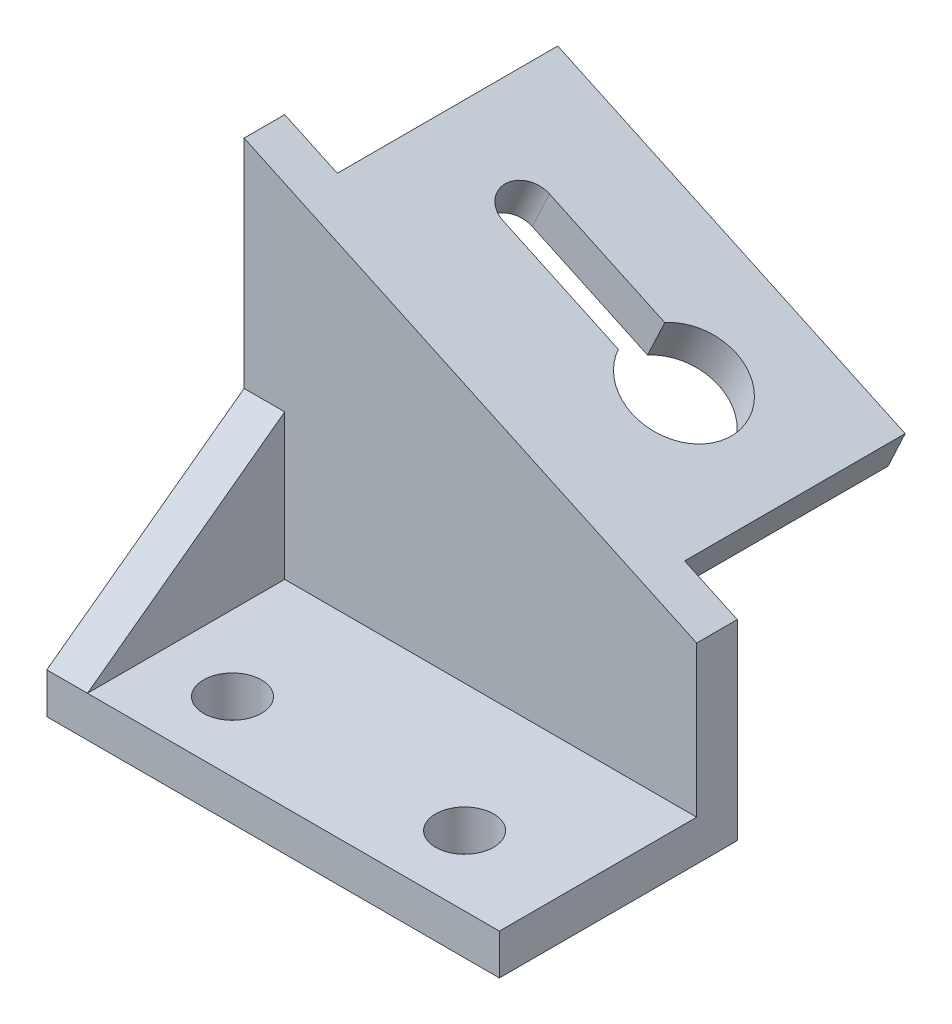
ISO-10303-21;
HEADER;
FILE_DESCRIPTION(('STEP AP214'),'2;1');
FILE_NAME('part.step','',(''),(''),'','','');
FILE_SCHEMA(('AUTOMOTIVE_DESIGN { 1 0 10303 214 1 1 1 1 }'));
ENDSEC;
DATA;
#1=APPLICATION_CONTEXT('core data for automotive mechanical design processes');
#2=APPLICATION_PROTOCOL_DEFINITION('international standard','automotive_design',2000,#1);
#3=PRODUCT_CONTEXT('',#1,'mechanical');
#4=PRODUCT('Part','Part','',(#3));
#5=PRODUCT_RELATED_PRODUCT_CATEGORY('part','',(#4));
#6=PRODUCT_DEFINITION_FORMATION('','',#4);
#7=PRODUCT_DEFINITION_CONTEXT('part definition',#1,'design');
#8=PRODUCT_DEFINITION('design','',#6,#7);
#9=PRODUCT_DEFINITION_SHAPE('','',#8);
#10=(LENGTH_UNIT() NAMED_UNIT(*) SI_UNIT(.MILLI.,.METRE.));
#11=(NAMED_UNIT(*) PLANE_ANGLE_UNIT() SI_UNIT($,.RADIAN.));
#12=(NAMED_UNIT(*) SI_UNIT($,.STERADIAN.) SOLID_ANGLE_UNIT());
#13=UNCERTAINTY_MEASURE_WITH_UNIT(LENGTH_MEASURE(1.E-05),#10,'distance_accuracy_value','');
#14=(GEOMETRIC_REPRESENTATION_CONTEXT(3) GLOBAL_UNCERTAINTY_ASSIGNED_CONTEXT((#13)) GLOBAL_UNIT_ASSIGNED_CONTEXT((#10,
#11,#12)) REPRESENTATION_CONTEXT('',''));
#15=CARTESIAN_POINT('',(0.,0.,0.));
#16=DIRECTION('',(0.,0.,1.));
#17=DIRECTION('',(1.,0.,0.));
#18=AXIS2_PLACEMENT_3D('',#15,#16,#17);
#19=CARTESIAN_POINT('',(0.,7.,0.));
#20=DIRECTION('',(0.,1.,0.));
#21=DIRECTION('',(0.,0.,1.));
#22=AXIS2_PLACEMENT_3D('',#19,#20,#21);
#23=PLANE('',#22);
#24=CARTESIAN_POINT('',(20.,7.,-12.));
#25=DIRECTION('',(0.,1.,0.));
#26=DIRECTION('',(0.,0.,1.));
#27=AXIS2_PLACEMENT_3D('',#24,#25,#26);
#28=CIRCLE('',#27,5.);
#29=CARTESIAN_POINT('',(20.,7.,-7.));
#30=VERTEX_POINT('',#29);
#31=EDGE_CURVE('E236',#30,#30,#28,.T.);
#32=ORIENTED_EDGE('',*,*,#31,.F.);
#33=EDGE_LOOP('',(#32));
#34=FACE_BOUND('',#33,.T.);
#35=CARTESIAN_POINT('',(60.,7.,-12.));
#36=DIRECTION('',(0.,1.,0.));
#37=DIRECTION('',(0.,0.,1.));
#38=AXIS2_PLACEMENT_3D('',#35,#36,#37);
#39=CIRCLE('',#38,5.);
#40=CARTESIAN_POINT('',(60.,7.,-7.));
#41=VERTEX_POINT('',#40);
#42=EDGE_CURVE('E240',#41,#41,#39,.T.);
#43=ORIENTED_EDGE('',*,*,#42,.F.);
#44=EDGE_LOOP('',(#43));
#45=FACE_BOUND('',#44,.T.);
#46=DIRECTION('',(0.,0.,1.));
#47=VECTOR('',#46,1.);
#48=CARTESIAN_POINT('',(7.,7.,0.));
#49=LINE('',#48,#47);
#50=CARTESIAN_POINT('',(7.,7.,-34.));
#51=VERTEX_POINT('',#50);
#52=CARTESIAN_POINT('',(7.,7.,0.));
#53=VERTEX_POINT('',#52);
#54=EDGE_CURVE('E247',#51,#53,#49,.T.);
#55=ORIENTED_EDGE('',*,*,#54,.T.);
#56=DIRECTION('',(1.,0.,0.));
#57=VECTOR('',#56,1.);
#58=CARTESIAN_POINT('',(0.,7.,0.));
#59=LINE('',#58,#57);
#60=CARTESIAN_POINT('',(78.,7.,0.));
#61=VERTEX_POINT('',#60);
#62=EDGE_CURVE('E296',#53,#61,#59,.T.);
#63=ORIENTED_EDGE('',*,*,#62,.T.);
#64=DIRECTION('',(0.,0.,-1.));
#65=VECTOR('',#64,1.);
#66=CARTESIAN_POINT('',(78.,7.,0.));
#67=LINE('',#66,#65);
#68=CARTESIAN_POINT('',(78.,7.,-34.));
#69=VERTEX_POINT('',#68);
#70=EDGE_CURVE('E292',#61,#69,#67,.T.);
#71=ORIENTED_EDGE('',*,*,#70,.T.);
#72=DIRECTION('',(-1.,0.,0.));
#73=VECTOR('',#72,1.);
#74=CARTESIAN_POINT('',(0.,7.,-34.));
#75=LINE('',#74,#73);
#76=EDGE_CURVE('E265',#69,#51,#75,.T.);
#77=ORIENTED_EDGE('',*,*,#76,.T.);
#78=EDGE_LOOP('',(#55,#63,#71,#77));
#79=FACE_BOUND('',#78,.T.);
#80=ADVANCED_FACE('F43',(#34,#45,#79),#23,.T.);
#81=CARTESIAN_POINT('',(0.,7.,-41.));
#82=DIRECTION('',(0.,0.,-1.));
#83=DIRECTION('',(-1.,0.,0.));
#84=AXIS2_PLACEMENT_3D('',#81,#82,#83);
#85=PLANE('',#84);
#86=DIRECTION('',(0.422618261740695,0.906307787036652,0.));
#87=VECTOR('',#86,1.);
#88=CARTESIAN_POINT('',(6.10475003818167,58.8016602094258,-41.));
#89=LINE('',#88,#87);
#90=CARTESIAN_POINT('',(6.10475003818167,58.8016602094258,-41.));
#91=VERTEX_POINT('',#90);
#92=CARTESIAN_POINT('',(9.06307787036653,65.1458147186824,-41.));
#93=VERTEX_POINT('',#92);
#94=EDGE_CURVE('E195',#91,#93,#89,.T.);
#95=ORIENTED_EDGE('',*,*,#94,.F.);
#96=DIRECTION('',(-0.906307787036652,0.422618261740694,0.));
#97=VECTOR('',#96,1.);
#98=CARTESIAN_POINT('',(65.9785942974486,30.8820281081504,-41.));
#99=LINE('',#98,#97);
#100=CARTESIAN_POINT('',(65.9785942974486,30.8820281081504,-41.));
#101=VERTEX_POINT('',#100);
#102=EDGE_CURVE('E208',#101,#91,#99,.T.);
#103=ORIENTED_EDGE('',*,*,#102,.F.);
#104=DIRECTION('',(-0.422618261740692,-0.906307787036653,0.));
#105=VECTOR('',#104,1.);
#106=CARTESIAN_POINT('',(68.9369221296335,37.2261826174069,-41.));
#107=LINE('',#106,#105);
#108=CARTESIAN_POINT('',(68.9369221296335,37.2261826174069,-41.));
#109=VERTEX_POINT('',#108);
#110=EDGE_CURVE('E185',#109,#101,#107,.T.);
#111=ORIENTED_EDGE('',*,*,#110,.F.);
#112=DIRECTION('',(0.906307787036652,-0.422618261740694,0.));
#113=VECTOR('',#112,1.);
#114=CARTESIAN_POINT('',(78.,33.,-41.));
#115=LINE('',#114,#113);
#116=CARTESIAN_POINT('',(78.,33.,-41.));
#117=VERTEX_POINT('',#116);
#118=EDGE_CURVE('E264',#109,#117,#115,.T.);
#119=ORIENTED_EDGE('',*,*,#118,.T.);
#120=DIRECTION('',(0.,-1.,0.));
#121=VECTOR('',#120,1.);
#122=CARTESIAN_POINT('',(78.,7.,-41.));
#123=LINE('',#122,#121);
#124=CARTESIAN_POINT('',(78.,0.,-41.));
#125=VERTEX_POINT('',#124);
#126=EDGE_CURVE('E301',#117,#125,#123,.T.);
#127=ORIENTED_EDGE('',*,*,#126,.T.);
#128=DIRECTION('',(1.,0.,0.));
#129=VECTOR('',#128,1.);
#130=CARTESIAN_POINT('',(0.,0.,-41.));
#131=LINE('',#130,#129);
#132=CARTESIAN_POINT('',(0.,0.,-41.));
#133=VERTEX_POINT('',#132);
#134=EDGE_CURVE('E288',#133,#125,#131,.T.);
#135=ORIENTED_EDGE('',*,*,#134,.F.);
#136=DIRECTION('',(0.,-1.,0.));
#137=VECTOR('',#136,1.);
#138=CARTESIAN_POINT('',(0.,7.,-41.));
#139=LINE('',#138,#137);
#140=CARTESIAN_POINT('',(0.,69.3719973360893,-41.));
#141=VERTEX_POINT('',#140);
#142=EDGE_CURVE('E315',#141,#133,#139,.T.);
#143=ORIENTED_EDGE('',*,*,#142,.F.);
#144=EDGE_CURVE('E270',#141,#93,#115,.T.);
#145=ORIENTED_EDGE('',*,*,#144,.T.);
#146=EDGE_LOOP('',(#95,#103,#111,#119,#127,#135,#143,#145));
#147=FACE_BOUND('',#146,.T.);
#148=ADVANCED_FACE('F45',(#147),#85,.T.);
#149=CARTESIAN_POINT('',(0.,7.,0.));
#150=DIRECTION('',(-1.,0.,0.));
#151=DIRECTION('',(0.,0.,1.));
#152=AXIS2_PLACEMENT_3D('',#149,#150,#151);
#153=PLANE('',#152);
#154=DIRECTION('',(0.,0.,-1.));
#155=VECTOR('',#154,1.);
#156=CARTESIAN_POINT('',(0.,0.,0.));
#157=LINE('',#156,#155);
#158=CARTESIAN_POINT('',(0.,0.,0.));
#159=VERTEX_POINT('',#158);
#160=EDGE_CURVE('E297',#159,#133,#157,.T.);
#161=ORIENTED_EDGE('',*,*,#160,.F.);
#162=DIRECTION('',(0.,-1.,0.));
#163=VECTOR('',#162,1.);
#164=CARTESIAN_POINT('',(0.,7.,0.));
#165=LINE('',#164,#163);
#166=CARTESIAN_POINT('',(0.,7.,0.));
#167=VERTEX_POINT('',#166);
#168=EDGE_CURVE('E319',#167,#159,#165,.T.);
#169=ORIENTED_EDGE('',*,*,#168,.F.);
#170=DIRECTION('',(0.,0.592390450477518,-0.805651012649425));
#171=VECTOR('',#170,1.);
#172=CARTESIAN_POINT('',(0.,32.,-34.));
#173=LINE('',#172,#171);
#174=CARTESIAN_POINT('',(0.,32.,-34.));
#175=VERTEX_POINT('',#174);
#176=EDGE_CURVE('E235',#167,#175,#173,.T.);
#177=ORIENTED_EDGE('',*,*,#176,.T.);
#178=DIRECTION('',(0.,1.,0.));
#179=VECTOR('',#178,1.);
#180=CARTESIAN_POINT('',(0.,69.3719973360893,-34.));
#181=LINE('',#180,#179);
#182=CARTESIAN_POINT('',(0.,69.3719973360893,-34.));
#183=VERTEX_POINT('',#182);
#184=EDGE_CURVE('E269',#175,#183,#181,.T.);
#185=ORIENTED_EDGE('',*,*,#184,.T.);
#186=DIRECTION('',(0.,0.,-1.));
#187=VECTOR('',#186,1.);
#188=CARTESIAN_POINT('',(0.,69.3719973360893,-34.));
#189=LINE('',#188,#187);
#190=EDGE_CURVE('E281',#183,#141,#189,.T.);
#191=ORIENTED_EDGE('',*,*,#190,.T.);
#192=ORIENTED_EDGE('',*,*,#142,.T.);
#193=EDGE_LOOP('',(#161,#169,#177,#185,#191,#192));
#194=FACE_BOUND('',#193,.T.);
#195=ADVANCED_FACE('F358',(#194),#153,.T.);
#196=CARTESIAN_POINT('',(0.,7.,0.));
#197=DIRECTION('',(0.,0.,-1.));
#198=DIRECTION('',(-1.,0.,0.));
#199=AXIS2_PLACEMENT_3D('',#196,#197,#198);
#200=PLANE('',#199);
#201=DIRECTION('',(1.,0.,0.));
#202=VECTOR('',#201,1.);
#203=CARTESIAN_POINT('',(0.,0.,0.));
#204=LINE('',#203,#202);
#205=CARTESIAN_POINT('',(78.,0.,0.));
#206=VERTEX_POINT('',#205);
#207=EDGE_CURVE('E309',#159,#206,#204,.T.);
#208=ORIENTED_EDGE('',*,*,#207,.T.);
#209=DIRECTION('',(0.,-1.,0.));
#210=VECTOR('',#209,1.);
#211=CARTESIAN_POINT('',(78.,7.,0.));
#212=LINE('',#211,#210);
#213=EDGE_CURVE('E322',#61,#206,#212,.T.);
#214=ORIENTED_EDGE('',*,*,#213,.F.);
#215=ORIENTED_EDGE('',*,*,#62,.F.);
#216=EDGE_CURVE('E298',#167,#53,#59,.T.);
#217=ORIENTED_EDGE('',*,*,#216,.F.);
#218=ORIENTED_EDGE('',*,*,#168,.T.);
#219=EDGE_LOOP('',(#208,#214,#215,#217,#218));
#220=FACE_BOUND('',#219,.T.);
#221=ADVANCED_FACE('F372',(#220),#200,.F.);
#222=CARTESIAN_POINT('',(78.,7.,0.));
#223=DIRECTION('',(-1.,0.,0.));
#224=DIRECTION('',(0.,0.,1.));
#225=AXIS2_PLACEMENT_3D('',#222,#223,#224);
#226=PLANE('',#225);
#227=DIRECTION('',(0.,0.,-1.));
#228=VECTOR('',#227,1.);
#229=CARTESIAN_POINT('',(78.,0.,0.));
#230=LINE('',#229,#228);
#231=EDGE_CURVE('E305',#206,#125,#230,.T.);
#232=ORIENTED_EDGE('',*,*,#231,.T.);
#233=ORIENTED_EDGE('',*,*,#126,.F.);
#234=DIRECTION('',(0.,0.,-1.));
#235=VECTOR('',#234,1.);
#236=CARTESIAN_POINT('',(78.,33.,-34.));
#237=LINE('',#236,#235);
#238=CARTESIAN_POINT('',(78.,33.,-34.));
#239=VERTEX_POINT('',#238);
#240=EDGE_CURVE('E284',#239,#117,#237,.T.);
#241=ORIENTED_EDGE('',*,*,#240,.F.);
#242=DIRECTION('',(0.,-1.,0.));
#243=VECTOR('',#242,1.);
#244=CARTESIAN_POINT('',(78.,7.,-34.));
#245=LINE('',#244,#243);
#246=EDGE_CURVE('E277',#239,#69,#245,.T.);
#247=ORIENTED_EDGE('',*,*,#246,.T.);
#248=ORIENTED_EDGE('',*,*,#70,.F.);
#249=ORIENTED_EDGE('',*,*,#213,.T.);
#250=EDGE_LOOP('',(#232,#233,#241,#247,#248,#249));
#251=FACE_BOUND('',#250,.T.);
#252=ADVANCED_FACE('F368',(#251),#226,.F.);
#253=CARTESIAN_POINT('',(0.,0.,0.));
#254=DIRECTION('',(0.,1.,0.));
#255=DIRECTION('',(0.,0.,1.));
#256=AXIS2_PLACEMENT_3D('',#253,#254,#255);
#257=PLANE('',#256);
#258=CARTESIAN_POINT('',(20.,0.,-12.));
#259=DIRECTION('',(0.,1.,0.));
#260=DIRECTION('',(0.,0.,1.));
#261=AXIS2_PLACEMENT_3D('',#258,#259,#260);
#262=CIRCLE('',#261,5.);
#263=CARTESIAN_POINT('',(20.,0.,-7.));
#264=VERTEX_POINT('',#263);
#265=EDGE_CURVE('E231',#264,#264,#262,.T.);
#266=ORIENTED_EDGE('',*,*,#265,.T.);
#267=EDGE_LOOP('',(#266));
#268=FACE_BOUND('',#267,.T.);
#269=CARTESIAN_POINT('',(60.,0.,-12.));
#270=DIRECTION('',(0.,1.,0.));
#271=DIRECTION('',(0.,0.,1.));
#272=AXIS2_PLACEMENT_3D('',#269,#270,#271);
#273=CIRCLE('',#272,5.);
#274=CARTESIAN_POINT('',(60.,0.,-7.));
#275=VERTEX_POINT('',#274);
#276=EDGE_CURVE('E230',#275,#275,#273,.T.);
#277=ORIENTED_EDGE('',*,*,#276,.T.);
#278=EDGE_LOOP('',(#277));
#279=FACE_BOUND('',#278,.T.);
#280=ORIENTED_EDGE('',*,*,#134,.T.);
#281=ORIENTED_EDGE('',*,*,#231,.F.);
#282=ORIENTED_EDGE('',*,*,#207,.F.);
#283=ORIENTED_EDGE('',*,*,#160,.T.);
#284=EDGE_LOOP('',(#280,#281,#282,#283));
#285=FACE_BOUND('',#284,.T.);
#286=ADVANCED_FACE('F365',(#268,#279,#285),#257,.F.);
#287=CARTESIAN_POINT('',(78.,33.,-34.));
#288=DIRECTION('',(0.422618261740694,0.906307787036653,0.));
#289=DIRECTION('',(-0.906307787036653,0.422618261740694,0.));
#290=AXIS2_PLACEMENT_3D('',#287,#288,#289);
#291=PLANE('',#290);
#292=CARTESIAN_POINT('',(23.6215327778008,58.3570957044416,-59.));
#293=DIRECTION('',(0.422618261740694,0.906307787036652,0.));
#294=DIRECTION('',(-0.906307787036652,0.422618261740694,0.));
#295=AXIS2_PLACEMENT_3D('',#292,#293,#294);
#296=CIRCLE('',#295,4.);
#297=CARTESIAN_POINT('',(23.6215327778008,58.3570957044416,-63.));
#298=VERTEX_POINT('',#297);
#299=CARTESIAN_POINT('',(23.6215327778008,58.3570957044416,-55.));
#300=VERTEX_POINT('',#299);
#301=EDGE_CURVE('E59',#298,#300,#296,.T.);
#302=ORIENTED_EDGE('',*,*,#301,.F.);
#303=DIRECTION('',(-0.906307787036653,0.422618261740694,0.));
#304=VECTOR('',#303,1.);
#305=CARTESIAN_POINT('',(23.6215327778008,58.3570957044416,-63.));
#306=LINE('',#305,#304);
#307=CARTESIAN_POINT('',(43.5038794105208,49.0858052075122,-63.));
#308=VERTEX_POINT('',#307);
#309=EDGE_CURVE('E175',#308,#298,#306,.T.);
#310=ORIENTED_EDGE('',*,*,#309,.F.);
#311=CARTESIAN_POINT('',(50.8107663889004,45.6785478522208,-59.));
#312=DIRECTION('',(0.422618261740694,0.906307787036652,0.));
#313=DIRECTION('',(-0.906307787036652,0.422618261740694,0.));
#314=AXIS2_PLACEMENT_3D('',#311,#312,#313);
#315=CIRCLE('',#314,9.);
#316=CARTESIAN_POINT('',(43.5038794105208,49.0858052075122,-55.));
#317=VERTEX_POINT('',#316);
#318=EDGE_CURVE('E157',#317,#308,#315,.T.);
#319=ORIENTED_EDGE('',*,*,#318,.F.);
#320=DIRECTION('',(0.906307787036653,-0.422618261740694,0.));
#321=VECTOR('',#320,1.);
#322=CARTESIAN_POINT('',(23.6215327778008,58.3570957044416,-55.));
#323=LINE('',#322,#321);
#324=EDGE_CURVE('E167',#300,#317,#323,.T.);
#325=ORIENTED_EDGE('',*,*,#324,.F.);
#326=EDGE_LOOP('',(#302,#310,#319,#325));
#327=FACE_BOUND('',#326,.T.);
#328=ORIENTED_EDGE('',*,*,#144,.F.);
#329=ORIENTED_EDGE('',*,*,#190,.F.);
#330=DIRECTION('',(0.906307787036652,-0.422618261740694,0.));
#331=VECTOR('',#330,1.);
#332=CARTESIAN_POINT('',(78.,33.,-34.));
#333=LINE('',#332,#331);
#334=EDGE_CURVE('E273',#183,#239,#333,.T.);
#335=ORIENTED_EDGE('',*,*,#334,.T.);
#336=ORIENTED_EDGE('',*,*,#240,.T.);
#337=ORIENTED_EDGE('',*,*,#118,.F.);
#338=DIRECTION('',(0.,0.,1.));
#339=VECTOR('',#338,1.);
#340=CARTESIAN_POINT('',(68.9369221296335,37.2261826174069,-79.));
#341=LINE('',#340,#339);
#342=CARTESIAN_POINT('',(68.9369221296335,37.2261826174069,-79.));
#343=VERTEX_POINT('',#342);
#344=EDGE_CURVE('E226',#343,#109,#341,.T.);
#345=ORIENTED_EDGE('',*,*,#344,.F.);
#346=DIRECTION('',(0.906307787036652,-0.422618261740694,0.));
#347=VECTOR('',#346,1.);
#348=CARTESIAN_POINT('',(9.06307787036653,65.1458147186824,-79.));
#349=LINE('',#348,#347);
#350=CARTESIAN_POINT('',(9.06307787036653,65.1458147186824,-79.));
#351=VERTEX_POINT('',#350);
#352=EDGE_CURVE('E190',#351,#343,#349,.T.);
#353=ORIENTED_EDGE('',*,*,#352,.F.);
#354=DIRECTION('',(0.,0.,1.));
#355=VECTOR('',#354,1.);
#356=CARTESIAN_POINT('',(9.06307787036653,65.1458147186824,-79.));
#357=LINE('',#356,#355);
#358=EDGE_CURVE('E204',#351,#93,#357,.T.);
#359=ORIENTED_EDGE('',*,*,#358,.T.);
#360=EDGE_LOOP('',(#328,#329,#335,#336,#337,#345,#353,#359));
#361=FACE_BOUND('',#360,.T.);
#362=ADVANCED_FACE('F172',(#327,#361),#291,.T.);
#363=CARTESIAN_POINT('',(0.,0.,-34.));
#364=DIRECTION('',(0.,0.,1.));
#365=DIRECTION('',(1.,0.,0.));
#366=AXIS2_PLACEMENT_3D('',#363,#364,#365);
#367=PLANE('',#366);
#368=DIRECTION('',(-1.,0.,0.));
#369=VECTOR('',#368,1.);
#370=CARTESIAN_POINT('',(7.,32.,-34.));
#371=LINE('',#370,#369);
#372=CARTESIAN_POINT('',(7.,32.,-34.));
#373=VERTEX_POINT('',#372);
#374=EDGE_CURVE('E258',#373,#175,#371,.T.);
#375=ORIENTED_EDGE('',*,*,#374,.F.);
#376=DIRECTION('',(0.,-1.,0.));
#377=VECTOR('',#376,1.);
#378=CARTESIAN_POINT('',(7.,7.,-34.));
#379=LINE('',#378,#377);
#380=EDGE_CURVE('E254',#373,#51,#379,.T.);
#381=ORIENTED_EDGE('',*,*,#380,.T.);
#382=ORIENTED_EDGE('',*,*,#76,.F.);
#383=ORIENTED_EDGE('',*,*,#246,.F.);
#384=ORIENTED_EDGE('',*,*,#334,.F.);
#385=ORIENTED_EDGE('',*,*,#184,.F.);
#386=EDGE_LOOP('',(#375,#381,#382,#383,#384,#385));
#387=FACE_BOUND('',#386,.T.);
#388=ADVANCED_FACE('F399',(#387),#367,.T.);
#389=CARTESIAN_POINT('',(7.,32.,-34.));
#390=DIRECTION('',(0.,0.805651012649425,0.592390450477518));
#391=DIRECTION('',(0.,-0.592390450477518,0.805651012649425));
#392=AXIS2_PLACEMENT_3D('',#389,#390,#391);
#393=PLANE('',#392);
#394=ORIENTED_EDGE('',*,*,#176,.F.);
#395=ORIENTED_EDGE('',*,*,#216,.T.);
#396=DIRECTION('',(0.,0.592390450477518,-0.805651012649425));
#397=VECTOR('',#396,1.);
#398=CARTESIAN_POINT('',(7.,32.,-34.));
#399=LINE('',#398,#397);
#400=EDGE_CURVE('E251',#53,#373,#399,.T.);
#401=ORIENTED_EDGE('',*,*,#400,.T.);
#402=ORIENTED_EDGE('',*,*,#374,.T.);
#403=EDGE_LOOP('',(#394,#395,#401,#402));
#404=FACE_BOUND('',#403,.T.);
#405=ADVANCED_FACE('F406',(#404),#393,.T.);
#406=CARTESIAN_POINT('',(7.,0.,0.));
#407=DIRECTION('',(1.,0.,0.));
#408=DIRECTION('',(0.,0.,-1.));
#409=AXIS2_PLACEMENT_3D('',#406,#407,#408);
#410=PLANE('',#409);
#411=ORIENTED_EDGE('',*,*,#54,.F.);
#412=ORIENTED_EDGE('',*,*,#380,.F.);
#413=ORIENTED_EDGE('',*,*,#400,.F.);
#414=EDGE_LOOP('',(#411,#412,#413));
#415=FACE_BOUND('',#414,.T.);
#416=ADVANCED_FACE('F404',(#415),#410,.T.);
#417=CARTESIAN_POINT('',(60.,0.,-12.));
#418=DIRECTION('',(0.,1.,0.));
#419=DIRECTION('',(0.,0.,1.));
#420=AXIS2_PLACEMENT_3D('',#417,#418,#419);
#421=CYLINDRICAL_SURFACE('',#420,5.);
#422=ORIENTED_EDGE('',*,*,#276,.F.);
#423=EDGE_LOOP('',(#422));
#424=FACE_BOUND('',#423,.T.);
#425=ORIENTED_EDGE('',*,*,#42,.T.);
#426=EDGE_LOOP('',(#425));
#427=FACE_BOUND('',#426,.T.);
#428=ADVANCED_FACE('F427',(#424,#427),#421,.F.);
#429=CARTESIAN_POINT('',(20.,0.,-12.));
#430=DIRECTION('',(0.,1.,0.));
#431=DIRECTION('',(0.,0.,1.));
#432=AXIS2_PLACEMENT_3D('',#429,#430,#431);
#433=CYLINDRICAL_SURFACE('',#432,5.);
#434=ORIENTED_EDGE('',*,*,#265,.F.);
#435=EDGE_LOOP('',(#434));
#436=FACE_BOUND('',#435,.T.);
#437=ORIENTED_EDGE('',*,*,#31,.T.);
#438=EDGE_LOOP('',(#437));
#439=FACE_BOUND('',#438,.T.);
#440=ADVANCED_FACE('F420',(#436,#439),#433,.F.);
#441=CARTESIAN_POINT('',(68.9369221296335,37.2261826174069,-79.));
#442=DIRECTION('',(-0.906307787036653,0.422618261740692,0.));
#443=DIRECTION('',(-0.422618261740692,-0.906307787036653,0.));
#444=AXIS2_PLACEMENT_3D('',#441,#442,#443);
#445=PLANE('',#444);
#446=ORIENTED_EDGE('',*,*,#110,.T.);
#447=DIRECTION('',(0.,0.,1.));
#448=VECTOR('',#447,1.);
#449=CARTESIAN_POINT('',(65.9785942974486,30.8820281081504,-79.));
#450=LINE('',#449,#448);
#451=CARTESIAN_POINT('',(65.9785942974486,30.8820281081504,-79.));
#452=VERTEX_POINT('',#451);
#453=EDGE_CURVE('E222',#452,#101,#450,.T.);
#454=ORIENTED_EDGE('',*,*,#453,.F.);
#455=DIRECTION('',(-0.422618261740692,-0.906307787036653,0.));
#456=VECTOR('',#455,1.);
#457=CARTESIAN_POINT('',(68.9369221296335,37.2261826174069,-79.));
#458=LINE('',#457,#456);
#459=EDGE_CURVE('E194',#343,#452,#458,.T.);
#460=ORIENTED_EDGE('',*,*,#459,.F.);
#461=ORIENTED_EDGE('',*,*,#344,.T.);
#462=EDGE_LOOP('',(#446,#454,#460,#461));
#463=FACE_BOUND('',#462,.T.);
#464=ADVANCED_FACE('F418',(#463),#445,.F.);
#465=CARTESIAN_POINT('',(65.9785942974486,30.8820281081504,-79.));
#466=DIRECTION('',(0.422618261740694,0.906307787036652,0.));
#467=DIRECTION('',(-0.906307787036652,0.422618261740694,0.));
#468=AXIS2_PLACEMENT_3D('',#465,#466,#467);
#469=PLANE('',#468);
#470=DIRECTION('',(-0.906307787036652,0.422618261740694,0.));
#471=VECTOR('',#470,1.);
#472=CARTESIAN_POINT('',(65.9785942974486,30.8820281081504,-63.));
#473=LINE('',#472,#471);
#474=CARTESIAN_POINT('',(40.545551578336,42.7416506982556,-63.));
#475=VERTEX_POINT('',#474);
#476=CARTESIAN_POINT('',(20.663204945616,52.0129411951851,-63.));
#477=VERTEX_POINT('',#476);
#478=EDGE_CURVE('E52',#475,#477,#473,.T.);
#479=ORIENTED_EDGE('',*,*,#478,.T.);
#480=CARTESIAN_POINT('',(20.663204945616,52.0129411951851,-59.));
#481=DIRECTION('',(0.422618261740694,0.906307787036652,0.));
#482=DIRECTION('',(-0.906307787036652,0.422618261740694,0.));
#483=AXIS2_PLACEMENT_3D('',#480,#481,#482);
#484=CIRCLE('',#483,4.);
#485=CARTESIAN_POINT('',(20.663204945616,52.0129411951851,-55.));
#486=VERTEX_POINT('',#485);
#487=EDGE_CURVE('E11',#477,#486,#484,.T.);
#488=ORIENTED_EDGE('',*,*,#487,.T.);
#489=DIRECTION('',(0.906307787036652,-0.422618261740694,0.));
#490=VECTOR('',#489,1.);
#491=CARTESIAN_POINT('',(65.9785942974486,30.8820281081504,-55.));
#492=LINE('',#491,#490);
#493=CARTESIAN_POINT('',(40.545551578336,42.7416506982556,-55.));
#494=VERTEX_POINT('',#493);
#495=EDGE_CURVE('E318',#486,#494,#492,.T.);
#496=ORIENTED_EDGE('',*,*,#495,.T.);
#497=CARTESIAN_POINT('',(47.8524385567156,39.3343933429643,-59.));
#498=DIRECTION('',(0.422618261740694,0.906307787036652,0.));
#499=DIRECTION('',(-0.906307787036652,0.422618261740694,0.));
#500=AXIS2_PLACEMENT_3D('',#497,#498,#499);
#501=CIRCLE('',#500,9.);
#502=EDGE_CURVE('E160',#494,#475,#501,.T.);
#503=ORIENTED_EDGE('',*,*,#502,.T.);
#504=EDGE_LOOP('',(#479,#488,#496,#503));
#505=FACE_BOUND('',#504,.T.);
#506=ORIENTED_EDGE('',*,*,#102,.T.);
#507=DIRECTION('',(0.,0.,1.));
#508=VECTOR('',#507,1.);
#509=CARTESIAN_POINT('',(6.10475003818167,58.8016602094258,-79.));
#510=LINE('',#509,#508);
#511=CARTESIAN_POINT('',(6.10475003818167,58.8016602094258,-79.));
#512=VERTEX_POINT('',#511);
#513=EDGE_CURVE('E218',#512,#91,#510,.T.);
#514=ORIENTED_EDGE('',*,*,#513,.F.);
#515=DIRECTION('',(-0.906307787036652,0.422618261740694,0.));
#516=VECTOR('',#515,1.);
#517=CARTESIAN_POINT('',(65.9785942974486,30.8820281081504,-79.));
#518=LINE('',#517,#516);
#519=EDGE_CURVE('E198',#452,#512,#518,.T.);
#520=ORIENTED_EDGE('',*,*,#519,.F.);
#521=ORIENTED_EDGE('',*,*,#453,.T.);
#522=EDGE_LOOP('',(#506,#514,#520,#521));
#523=FACE_BOUND('',#522,.T.);
#524=ADVANCED_FACE('F334',(#505,#523),#469,.F.);
#525=CARTESIAN_POINT('',(6.10475003818167,58.8016602094258,-79.));
#526=DIRECTION('',(0.906307787036652,-0.422618261740695,0.));
#527=DIRECTION('',(0.422618261740695,0.906307787036652,0.));
#528=AXIS2_PLACEMENT_3D('',#525,#526,#527);
#529=PLANE('',#528);
#530=ORIENTED_EDGE('',*,*,#94,.T.);
#531=ORIENTED_EDGE('',*,*,#358,.F.);
#532=DIRECTION('',(0.422618261740695,0.906307787036652,0.));
#533=VECTOR('',#532,1.);
#534=CARTESIAN_POINT('',(6.10475003818167,58.8016602094258,-79.));
#535=LINE('',#534,#533);
#536=EDGE_CURVE('E201',#512,#351,#535,.T.);
#537=ORIENTED_EDGE('',*,*,#536,.F.);
#538=ORIENTED_EDGE('',*,*,#513,.T.);
#539=EDGE_LOOP('',(#530,#531,#537,#538));
#540=FACE_BOUND('',#539,.T.);
#541=ADVANCED_FACE('F348',(#540),#529,.F.);
#542=CARTESIAN_POINT('',(0.,0.,-79.));
#543=DIRECTION('',(0.,0.,-1.));
#544=DIRECTION('',(-1.,0.,0.));
#545=AXIS2_PLACEMENT_3D('',#542,#543,#544);
#546=PLANE('',#545);
#547=ORIENTED_EDGE('',*,*,#352,.T.);
#548=ORIENTED_EDGE('',*,*,#459,.T.);
#549=ORIENTED_EDGE('',*,*,#519,.T.);
#550=ORIENTED_EDGE('',*,*,#536,.T.);
#551=EDGE_LOOP('',(#547,#548,#549,#550));
#552=FACE_BOUND('',#551,.T.);
#553=ADVANCED_FACE('F341',(#552),#546,.T.);
#554=CARTESIAN_POINT('',(7.56203883165446,23.9173997970488,-59.));
#555=DIRECTION('',(0.422618261740694,0.906307787036652,0.));
#556=DIRECTION('',(-0.906307787036652,0.422618261740694,0.));
#557=AXIS2_PLACEMENT_3D('',#554,#555,#556);
#558=CYLINDRICAL_SURFACE('',#557,4.);
#559=DIRECTION('',(0.422618261740694,0.906307787036652,0.));
#560=VECTOR('',#559,1.);
#561=CARTESIAN_POINT('',(7.56203883165446,23.9173997970488,-63.));
#562=LINE('',#561,#560);
#563=EDGE_CURVE('E182',#477,#298,#562,.T.);
#564=ORIENTED_EDGE('',*,*,#563,.T.);
#565=ORIENTED_EDGE('',*,*,#301,.T.);
#566=DIRECTION('',(0.422618261740694,0.906307787036652,0.));
#567=VECTOR('',#566,1.);
#568=CARTESIAN_POINT('',(7.56203883165446,23.9173997970488,-55.));
#569=LINE('',#568,#567);
#570=EDGE_CURVE('E164',#486,#300,#569,.T.);
#571=ORIENTED_EDGE('',*,*,#570,.F.);
#572=ORIENTED_EDGE('',*,*,#487,.F.);
#573=EDGE_LOOP('',(#564,#565,#571,#572));
#574=FACE_BOUND('',#573,.T.);
#575=ADVANCED_FACE('F339',(#574),#558,.F.);
#576=CARTESIAN_POINT('',(7.56203883165446,23.9173997970488,-63.));
#577=DIRECTION('',(0.,0.,-1.));
#578=DIRECTION('',(-1.,0.,0.));
#579=AXIS2_PLACEMENT_3D('',#576,#577,#578);
#580=PLANE('',#579);
#581=DIRECTION('',(0.422618261740694,0.906307787036652,0.));
#582=VECTOR('',#581,1.);
#583=CARTESIAN_POINT('',(27.4443854643745,14.6461093001194,-63.));
#584=LINE('',#583,#582);
#585=EDGE_CURVE('E163',#475,#308,#584,.T.);
#586=ORIENTED_EDGE('',*,*,#585,.T.);
#587=ORIENTED_EDGE('',*,*,#309,.T.);
#588=ORIENTED_EDGE('',*,*,#563,.F.);
#589=ORIENTED_EDGE('',*,*,#478,.F.);
#590=EDGE_LOOP('',(#586,#587,#588,#589));
#591=FACE_BOUND('',#590,.T.);
#592=ADVANCED_FACE('F338',(#591),#580,.F.);
#593=CARTESIAN_POINT('',(34.751272442754,11.238851944828,-59.));
#594=DIRECTION('',(0.422618261740694,0.906307787036652,0.));
#595=DIRECTION('',(-0.906307787036652,0.422618261740694,0.));
#596=AXIS2_PLACEMENT_3D('',#593,#594,#595);
#597=CYLINDRICAL_SURFACE('',#596,9.);
#598=DIRECTION('',(0.422618261740694,0.906307787036652,0.));
#599=VECTOR('',#598,1.);
#600=CARTESIAN_POINT('',(27.4443854643745,14.6461093001194,-55.));
#601=LINE('',#600,#599);
#602=EDGE_CURVE('E67',#494,#317,#601,.T.);
#603=ORIENTED_EDGE('',*,*,#602,.T.);
#604=ORIENTED_EDGE('',*,*,#318,.T.);
#605=ORIENTED_EDGE('',*,*,#585,.F.);
#606=ORIENTED_EDGE('',*,*,#502,.F.);
#607=EDGE_LOOP('',(#603,#604,#605,#606));
#608=FACE_BOUND('',#607,.T.);
#609=ADVANCED_FACE('F154',(#608),#597,.F.);
#610=CARTESIAN_POINT('',(7.56203883165446,23.9173997970488,-55.));
#611=DIRECTION('',(0.,0.,1.));
#612=DIRECTION('',(1.,0.,0.));
#613=AXIS2_PLACEMENT_3D('',#610,#611,#612);
#614=PLANE('',#613);
#615=ORIENTED_EDGE('',*,*,#570,.T.);
#616=ORIENTED_EDGE('',*,*,#324,.T.);
#617=ORIENTED_EDGE('',*,*,#602,.F.);
#618=ORIENTED_EDGE('',*,*,#495,.F.);
#619=EDGE_LOOP('',(#615,#616,#617,#618));
#620=FACE_BOUND('',#619,.T.);
#621=ADVANCED_FACE('F168',(#620),#614,.F.);
#622=CLOSED_SHELL('',(#80,#148,#195,#221,#252,#286,#362,#388,#405,#416,#428,#440,#464,#524,#541,
#553,#575,#592,#609,#621));
#623=MANIFOLD_SOLID_BREP('B2',#622);
#624=ADVANCED_BREP_SHAPE_REPRESENTATION('',(#18,#623),#14);
#625=SHAPE_DEFINITION_REPRESENTATION(#9,#624);
ENDSEC;
END-ISO-10303-21;
